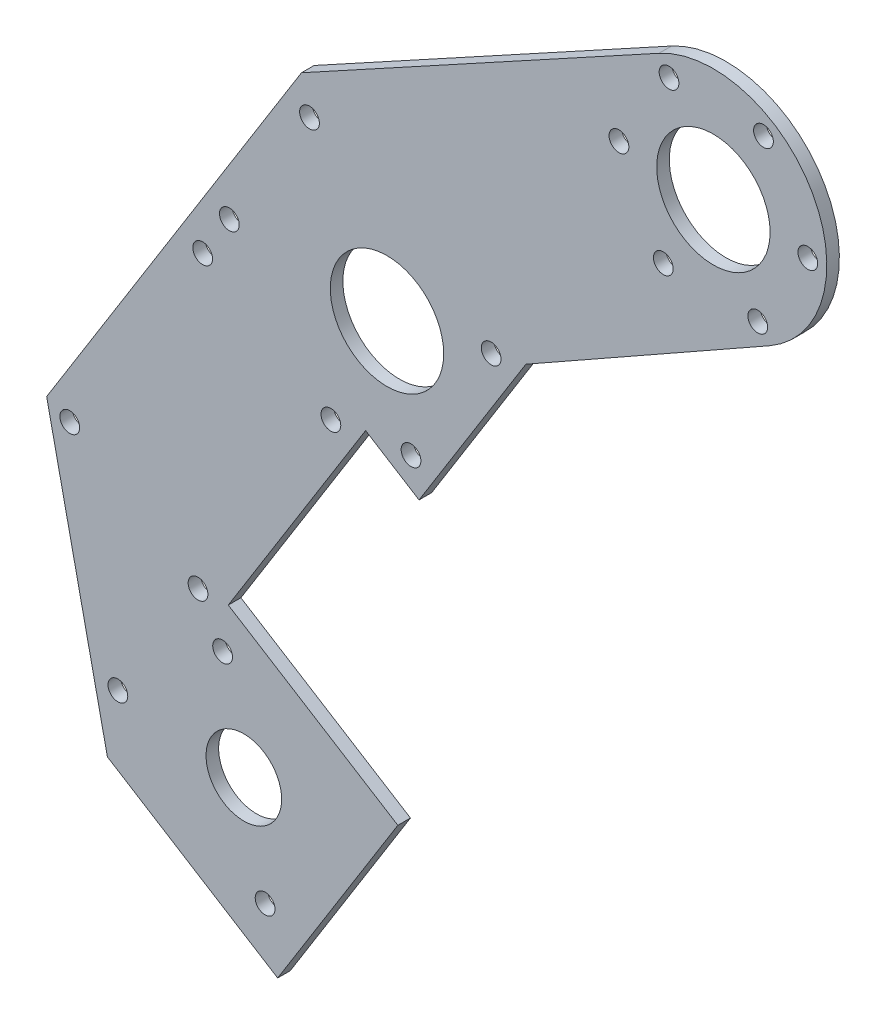
ISO-10303-21;
HEADER;
FILE_DESCRIPTION(('STEP AP214'),'2;1');
FILE_NAME('part.step','',(''),(''),'','','');
FILE_SCHEMA(('AUTOMOTIVE_DESIGN { 1 0 10303 214 1 1 1 1 }'));
ENDSEC;
DATA;
#1=APPLICATION_CONTEXT('core data for automotive mechanical design processes');
#2=APPLICATION_PROTOCOL_DEFINITION('international standard','automotive_design',2000,#1);
#3=PRODUCT_CONTEXT('',#1,'mechanical');
#4=PRODUCT('Part','Part','',(#3));
#5=PRODUCT_RELATED_PRODUCT_CATEGORY('part','',(#4));
#6=PRODUCT_DEFINITION_FORMATION('','',#4);
#7=PRODUCT_DEFINITION_CONTEXT('part definition',#1,'design');
#8=PRODUCT_DEFINITION('design','',#6,#7);
#9=PRODUCT_DEFINITION_SHAPE('','',#8);
#10=(LENGTH_UNIT() NAMED_UNIT(*) SI_UNIT(.MILLI.,.METRE.));
#11=(NAMED_UNIT(*) PLANE_ANGLE_UNIT() SI_UNIT($,.RADIAN.));
#12=(NAMED_UNIT(*) SI_UNIT($,.STERADIAN.) SOLID_ANGLE_UNIT());
#13=UNCERTAINTY_MEASURE_WITH_UNIT(LENGTH_MEASURE(1.E-05),#10,'distance_accuracy_value','');
#14=(GEOMETRIC_REPRESENTATION_CONTEXT(3) GLOBAL_UNCERTAINTY_ASSIGNED_CONTEXT((#13)) GLOBAL_UNIT_ASSIGNED_CONTEXT((#10,
#11,#12)) REPRESENTATION_CONTEXT('',''));
#15=CARTESIAN_POINT('',(0.,0.,0.));
#16=DIRECTION('',(0.,0.,1.));
#17=DIRECTION('',(1.,0.,0.));
#18=AXIS2_PLACEMENT_3D('',#15,#16,#17);
#19=CARTESIAN_POINT('',(98.394472265717,685.809641801936,-11.0195994744183));
#20=DIRECTION('',(0.,0.,1.));
#21=DIRECTION('',(1.,0.,0.));
#22=AXIS2_PLACEMENT_3D('',#19,#20,#21);
#23=PLANE('',#22);
#24=CARTESIAN_POINT('',(111.01317474527,706.00378709166,-11.0195994744183));
#25=DIRECTION('',(0.,0.,1.));
#26=DIRECTION('',(1.,0.,0.));
#27=AXIS2_PLACEMENT_3D('',#24,#25,#26);
#28=CIRCLE('',#27,2.48919999999998);
#29=CARTESIAN_POINT('',(113.50237474527,706.00378709166,-11.0195994744183));
#30=VERTEX_POINT('',#29);
#31=EDGE_CURVE('E375',#30,#30,#28,.T.);
#32=ORIENTED_EDGE('',*,*,#31,.F.);
#33=EDGE_LOOP('',(#32));
#34=FACE_BOUND('',#33,.T.);
#35=CARTESIAN_POINT('',(122.192466334109,684.978597536707,-11.0195994744183));
#36=DIRECTION('',(0.,0.,1.));
#37=DIRECTION('',(1.,0.,0.));
#38=AXIS2_PLACEMENT_3D('',#35,#36,#37);
#39=CIRCLE('',#38,2.48919999999998);
#40=CARTESIAN_POINT('',(124.681666334109,684.978597536707,-11.0195994744183));
#41=VERTEX_POINT('',#40);
#42=EDGE_CURVE('E379',#41,#41,#39,.T.);
#43=ORIENTED_EDGE('',*,*,#42,.F.);
#44=EDGE_LOOP('',(#43));
#45=FACE_BOUND('',#44,.T.);
#46=CARTESIAN_POINT('',(109.573763854556,664.784452246982,-11.0195994744183));
#47=DIRECTION('',(0.,0.,1.));
#48=DIRECTION('',(1.,0.,0.));
#49=AXIS2_PLACEMENT_3D('',#46,#47,#48);
#50=CIRCLE('',#49,2.48919999999998);
#51=CARTESIAN_POINT('',(112.062963854556,664.784452246982,-11.0195994744183));
#52=VERTEX_POINT('',#51);
#53=EDGE_CURVE('E389',#52,#52,#50,.T.);
#54=ORIENTED_EDGE('',*,*,#53,.F.);
#55=EDGE_LOOP('',(#54));
#56=FACE_BOUND('',#55,.T.);
#57=CARTESIAN_POINT('',(85.7757697861638,665.61549651221,-11.0195994744183));
#58=DIRECTION('',(0.,0.,1.));
#59=DIRECTION('',(1.,0.,0.));
#60=AXIS2_PLACEMENT_3D('',#57,#58,#59);
#61=CIRCLE('',#60,2.48919999999998);
#62=CARTESIAN_POINT('',(88.2649697861638,665.61549651221,-11.0195994744183));
#63=VERTEX_POINT('',#62);
#64=EDGE_CURVE('E397',#63,#63,#61,.T.);
#65=ORIENTED_EDGE('',*,*,#64,.F.);
#66=EDGE_LOOP('',(#65));
#67=FACE_BOUND('',#66,.T.);
#68=CARTESIAN_POINT('',(74.5964781973248,686.640686067164,-11.0195994744183));
#69=DIRECTION('',(0.,0.,1.));
#70=DIRECTION('',(1.,0.,0.));
#71=AXIS2_PLACEMENT_3D('',#68,#69,#70);
#72=CIRCLE('',#71,2.48919999999998);
#73=CARTESIAN_POINT('',(77.0856781973248,686.640686067164,-11.0195994744183));
#74=VERTEX_POINT('',#73);
#75=EDGE_CURVE('E405',#74,#74,#72,.T.);
#76=ORIENTED_EDGE('',*,*,#75,.F.);
#77=EDGE_LOOP('',(#76));
#78=FACE_BOUND('',#77,.T.);
#79=CARTESIAN_POINT('',(87.2151806768779,706.834831356889,-11.0195994744183));
#80=DIRECTION('',(0.,0.,1.));
#81=DIRECTION('',(1.,0.,0.));
#82=AXIS2_PLACEMENT_3D('',#79,#80,#81);
#83=CIRCLE('',#82,2.48919999999998);
#84=CARTESIAN_POINT('',(89.7043806768779,706.834831356889,-11.0195994744183));
#85=VERTEX_POINT('',#84);
#86=EDGE_CURVE('E413',#85,#85,#83,.T.);
#87=ORIENTED_EDGE('',*,*,#86,.F.);
#88=EDGE_LOOP('',(#87));
#89=FACE_BOUND('',#88,.T.);
#90=CARTESIAN_POINT('',(-25.2787103792217,525.372785730047,-11.0195994744183));
#91=DIRECTION('',(0.,0.,1.));
#92=DIRECTION('',(1.,0.,0.));
#93=AXIS2_PLACEMENT_3D('',#90,#91,#92);
#94=CIRCLE('',#93,2.48919999999999);
#95=CARTESIAN_POINT('',(-22.7895103792217,525.372785730047,-11.0195994744183));
#96=VERTEX_POINT('',#95);
#97=EDGE_CURVE('E421',#96,#96,#94,.T.);
#98=ORIENTED_EDGE('',*,*,#97,.F.);
#99=EDGE_LOOP('',(#98));
#100=FACE_BOUND('',#99,.T.);
#101=CARTESIAN_POINT('',(-14.5684366072069,475.714654112672,-11.0195994744183));
#102=DIRECTION('',(0.,0.,1.));
#103=DIRECTION('',(1.,0.,0.));
#104=AXIS2_PLACEMENT_3D('',#101,#102,#103);
#105=CIRCLE('',#104,2.48919999999999);
#106=CARTESIAN_POINT('',(-12.0792366072069,475.714654112672,-11.0195994744183));
#107=VERTEX_POINT('',#106);
#108=EDGE_CURVE('E429',#107,#107,#105,.T.);
#109=ORIENTED_EDGE('',*,*,#108,.F.);
#110=EDGE_LOOP('',(#109));
#111=FACE_BOUND('',#110,.T.);
#112=CARTESIAN_POINT('',(-3.3816119758126,652.837445435395,-11.0195994744183));
#113=DIRECTION('',(0.,0.,1.));
#114=DIRECTION('',(1.,0.,0.));
#115=AXIS2_PLACEMENT_3D('',#112,#113,#114);
#116=CIRCLE('',#115,2.48919999999999);
#117=CARTESIAN_POINT('',(-0.892411975812611,652.837445435395,-11.0195994744183));
#118=VERTEX_POINT('',#117);
#119=EDGE_CURVE('E437',#118,#118,#116,.T.);
#120=ORIENTED_EDGE('',*,*,#119,.F.);
#121=EDGE_LOOP('',(#120));
#122=FACE_BOUND('',#121,.T.);
#123=CARTESIAN_POINT('',(42.3917840142308,624.235053148408,-11.0195994744183));
#124=DIRECTION('',(0.,0.,1.));
#125=DIRECTION('',(1.,0.,0.));
#126=AXIS2_PLACEMENT_3D('',#123,#124,#125);
#127=CIRCLE('',#126,2.48919999999999);
#128=CARTESIAN_POINT('',(44.8809840142308,624.235053148408,-11.0195994744183));
#129=VERTEX_POINT('',#128);
#130=EDGE_CURVE('E445',#129,#129,#127,.T.);
#131=ORIENTED_EDGE('',*,*,#130,.F.);
#132=EDGE_LOOP('',(#131));
#133=FACE_BOUND('',#132,.T.);
#134=CARTESIAN_POINT('',(22.2018600469461,591.924420684848,-11.0195994744183));
#135=DIRECTION('',(0.,0.,1.));
#136=DIRECTION('',(1.,0.,0.));
#137=AXIS2_PLACEMENT_3D('',#134,#135,#136);
#138=CIRCLE('',#137,2.48919999999999);
#139=CARTESIAN_POINT('',(24.6910600469461,591.924420684848,-11.0195994744183));
#140=VERTEX_POINT('',#139);
#141=EDGE_CURVE('E453',#140,#140,#138,.T.);
#142=ORIENTED_EDGE('',*,*,#141,.F.);
#143=EDGE_LOOP('',(#142));
#144=FACE_BOUND('',#143,.T.);
#145=CARTESIAN_POINT('',(-23.5715359430975,620.526812971834,-11.0195994744183));
#146=DIRECTION('',(0.,0.,1.));
#147=DIRECTION('',(1.,0.,0.));
#148=AXIS2_PLACEMENT_3D('',#145,#146,#147);
#149=CIRCLE('',#148,2.48919999999999);
#150=CARTESIAN_POINT('',(-21.0823359430975,620.526812971834,-11.0195994744183));
#151=VERTEX_POINT('',#150);
#152=EDGE_CURVE('E461',#151,#151,#149,.T.);
#153=ORIENTED_EDGE('',*,*,#152,.F.);
#154=EDGE_LOOP('',(#153));
#155=FACE_BOUND('',#154,.T.);
#156=CARTESIAN_POINT('',(-31.4748442986401,535.981130962536,-11.0195994744183));
#157=DIRECTION('',(0.,0.,1.));
#158=DIRECTION('',(1.,0.,0.));
#159=AXIS2_PLACEMENT_3D('',#156,#157,#158);
#160=CIRCLE('',#159,2.48919999999999);
#161=CARTESIAN_POINT('',(-28.9856442986401,535.981130962536,-11.0195994744183));
#162=VERTEX_POINT('',#161);
#163=EDGE_CURVE('E469',#162,#162,#160,.T.);
#164=ORIENTED_EDGE('',*,*,#163,.F.);
#165=EDGE_LOOP('',(#164));
#166=FACE_BOUND('',#165,.T.);
#167=CARTESIAN_POINT('',(-63.7854767622009,556.17105492982,-11.0195994744183));
#168=DIRECTION('',(0.,0.,1.));
#169=DIRECTION('',(1.,0.,0.));
#170=AXIS2_PLACEMENT_3D('',#167,#168,#169);
#171=CIRCLE('',#170,2.48919999999999);
#172=CARTESIAN_POINT('',(-61.2962767622009,556.17105492982,-11.0195994744183));
#173=VERTEX_POINT('',#172);
#174=EDGE_CURVE('E477',#173,#173,#171,.T.);
#175=ORIENTED_EDGE('',*,*,#174,.F.);
#176=EDGE_LOOP('',(#175));
#177=FACE_BOUND('',#176,.T.);
#178=CARTESIAN_POINT('',(-51.6647682659239,503.670498498975,-11.0195994744183));
#179=DIRECTION('',(0.,0.,1.));
#180=DIRECTION('',(1.,0.,0.));
#181=AXIS2_PLACEMENT_3D('',#178,#179,#180);
#182=CIRCLE('',#181,2.48919999999999);
#183=CARTESIAN_POINT('',(-49.1755682659239,503.670498498975,-11.0195994744183));
#184=VERTEX_POINT('',#183);
#185=EDGE_CURVE('E485',#184,#184,#182,.T.);
#186=ORIENTED_EDGE('',*,*,#185,.F.);
#187=EDGE_LOOP('',(#186));
#188=FACE_BOUND('',#187,.T.);
#189=CARTESIAN_POINT('',(2.0091218648738,589.566678183255,-11.0195994744183));
#190=DIRECTION('',(0.,0.,1.));
#191=DIRECTION('',(1.,0.,0.));
#192=AXIS2_PLACEMENT_3D('',#189,#190,#191);
#193=CIRCLE('',#192,2.48919999999999);
#194=CARTESIAN_POINT('',(4.49832186487379,589.566678183255,-11.0195994744183));
#195=VERTEX_POINT('',#194);
#196=EDGE_CURVE('E493',#195,#195,#193,.T.);
#197=ORIENTED_EDGE('',*,*,#196,.F.);
#198=EDGE_LOOP('',(#197));
#199=FACE_BOUND('',#198,.T.);
#200=CARTESIAN_POINT('',(-30.3015105986869,609.756602150538,-11.0195994744183));
#201=DIRECTION('',(0.,0.,1.));
#202=DIRECTION('',(1.,0.,0.));
#203=AXIS2_PLACEMENT_3D('',#200,#201,#202);
#204=CIRCLE('',#203,2.48919999999999);
#205=CARTESIAN_POINT('',(-27.8123105986869,609.756602150538,-11.0195994744183));
#206=VERTEX_POINT('',#205);
#207=EDGE_CURVE('E501',#206,#206,#204,.T.);
#208=ORIENTED_EDGE('',*,*,#207,.F.);
#209=EDGE_LOOP('',(#208));
#210=FACE_BOUND('',#209,.T.);
#211=CARTESIAN_POINT('',(16.1415062297891,618.174698630963,-11.0195994744183));
#212=DIRECTION('',(0.,0.,1.));
#213=DIRECTION('',(1.,0.,0.));
#214=AXIS2_PLACEMENT_3D('',#211,#212,#213);
#215=CIRCLE('',#214,14.2875);
#216=CARTESIAN_POINT('',(30.4290062297891,618.174698630963,-11.0195994744183));
#217=VERTEX_POINT('',#216);
#218=EDGE_CURVE('E518',#217,#217,#215,.T.);
#219=ORIENTED_EDGE('',*,*,#218,.F.);
#220=EDGE_LOOP('',(#219));
#221=FACE_BOUND('',#220,.T.);
#222=DIRECTION('',(0.848048096156436,-0.529919264233189,0.));
#223=VECTOR('',#222,1.);
#224=CARTESIAN_POINT('',(-11.4036028792613,461.040918112805,-11.0195994744183));
#225=LINE('',#224,#223);
#226=CARTESIAN_POINT('',(-54.3078997353251,487.850498283378,-11.0195994744183));
#227=VERTEX_POINT('',#226);
#228=CARTESIAN_POINT('',(-11.4036028792613,461.040918112805,-11.0195994744183));
#229=VERTEX_POINT('',#228);
#230=EDGE_CURVE('E195',#227,#229,#225,.T.);
#231=ORIENTED_EDGE('',*,*,#230,.T.);
#232=DIRECTION('',(0.529919264233189,0.848048096156436,0.));
#233=VECTOR('',#232,1.);
#234=CARTESIAN_POINT('',(-11.4036028792613,461.040918112805,-11.0195994744183));
#235=LINE('',#234,#233);
#236=CARTESIAN_POINT('',(18.8812830716653,509.506866808146,-11.0195994744183));
#237=VERTEX_POINT('',#236);
#238=EDGE_CURVE('E113',#229,#237,#235,.T.);
#239=ORIENTED_EDGE('',*,*,#238,.T.);
#240=DIRECTION('',(-0.848048096156436,0.529919264233189,0.));
#241=VECTOR('',#240,1.);
#242=CARTESIAN_POINT('',(18.8812830716653,509.506866808146,-11.0195994744183));
#243=LINE('',#242,#241);
#244=CARTESIAN_POINT('',(-23.8464673555439,536.206128526138,-11.0195994744183));
#245=VERTEX_POINT('',#244);
#246=EDGE_CURVE('E228',#237,#245,#243,.T.);
#247=ORIENTED_EDGE('',*,*,#246,.T.);
#248=DIRECTION('',(0.529919264233191,0.848048096156435,0.));
#249=VECTOR('',#248,1.);
#250=CARTESIAN_POINT('',(-23.8464673555439,536.206128526138,-11.0195994744183));
#251=LINE('',#250,#249);
#252=CARTESIAN_POINT('',(10.7592146033479,591.586796265968,-11.0195994744183));
#253=VERTEX_POINT('',#252);
#254=EDGE_CURVE('E248',#245,#253,#251,.T.);
#255=ORIENTED_EDGE('',*,*,#254,.T.);
#256=DIRECTION('',(0.848048096156436,-0.529919264233189,0.));
#257=VECTOR('',#256,1.);
#258=CARTESIAN_POINT('',(10.7592146033479,591.586796265968,-11.0195994744183));
#259=LINE('',#258,#257);
#260=CARTESIAN_POINT('',(24.2219781298311,583.174327946266,-11.0195994744183));
#261=VERTEX_POINT('',#260);
#262=EDGE_CURVE('E244',#253,#261,#259,.T.);
#263=ORIENTED_EDGE('',*,*,#262,.T.);
#264=DIRECTION('',(0.529919264233189,0.848048096156436,0.));
#265=VECTOR('',#264,1.);
#266=CARTESIAN_POINT('',(24.2219781298311,583.174327946266,-11.0195994744183));
#267=LINE('',#266,#265);
#268=CARTESIAN_POINT('',(51.1418767528772,626.255171231013,-11.0195994744183));
#269=VERTEX_POINT('',#268);
#270=EDGE_CURVE('E247',#261,#269,#267,.T.);
#271=ORIENTED_EDGE('',*,*,#270,.T.);
#272=DIRECTION('',(0.87042361723326,0.49230349030102,0.));
#273=VECTOR('',#272,1.);
#274=CARTESIAN_POINT('',(51.1418767528772,626.255171231013,-11.0195994744183));
#275=LINE('',#274,#273);
#276=CARTESIAN_POINT('',(112.462044501226,660.937286939583,-11.0195994744183));
#277=VERTEX_POINT('',#276);
#278=EDGE_CURVE('E252',#269,#277,#275,.T.);
#279=ORIENTED_EDGE('',*,*,#278,.T.);
#280=CARTESIAN_POINT('',(98.394472265717,685.809641801936,-11.0195994744183));
#281=DIRECTION('',(0.,0.,1.));
#282=DIRECTION('',(1.,0.,0.));
#283=AXIS2_PLACEMENT_3D('',#280,#281,#282);
#284=CIRCLE('',#283,28.5750000000007);
#285=CARTESIAN_POINT('',(84.6779568869163,710.877306848029,-11.0195994744183));
#286=VERTEX_POINT('',#285);
#287=EDGE_CURVE('E141',#277,#286,#284,.T.);
#288=ORIENTED_EDGE('',*,*,#287,.T.);
#289=DIRECTION('',(-0.877258619282813,-0.480018036009078,0.));
#290=VECTOR('',#289,1.);
#291=CARTESIAN_POINT('',(-5.40173005852552,661.587538173868,-11.0195994744183));
#292=LINE('',#291,#290);
#293=CARTESIAN_POINT('',(-5.40173005852552,661.587538173868,-11.0195994744183));
#294=VERTEX_POINT('',#293);
#295=EDGE_CURVE('E135',#286,#294,#292,.T.);
#296=ORIENTED_EDGE('',*,*,#295,.T.);
#297=DIRECTION('',(-0.529919264233189,-0.848048096156436,0.));
#298=VECTOR('',#297,1.);
#299=CARTESIAN_POINT('',(-69.6154861059628,558.824047131732,-11.0195994744183));
#300=LINE('',#299,#298);
#301=CARTESIAN_POINT('',(-69.6154861059628,558.824047131732,-11.0195994744183));
#302=VERTEX_POINT('',#301);
#303=EDGE_CURVE('E139',#294,#302,#300,.T.);
#304=ORIENTED_EDGE('',*,*,#303,.T.);
#305=DIRECTION('',(0.210832160866466,-0.977522275932562,0.));
#306=VECTOR('',#305,1.);
#307=CARTESIAN_POINT('',(-54.3078997353251,487.850498283378,-11.0195994744183));
#308=LINE('',#307,#306);
#309=EDGE_CURVE('E61',#302,#227,#308,.T.);
#310=ORIENTED_EDGE('',*,*,#309,.T.);
#311=EDGE_LOOP('',(#231,#239,#247,#255,#263,#271,#279,#288,#296,#304,#310));
#312=FACE_BOUND('',#311,.T.);
#313=CARTESIAN_POINT('',(98.394472265717,685.809641801936,-11.0195994744183));
#314=DIRECTION('',(0.,0.,1.));
#315=DIRECTION('',(1.,0.,0.));
#316=AXIS2_PLACEMENT_3D('',#313,#314,#315);
#317=CIRCLE('',#316,14.2875000001997);
#318=CARTESIAN_POINT('',(112.681972265917,685.809641801936,-11.0195994744183));
#319=VERTEX_POINT('',#318);
#320=EDGE_CURVE('E168',#319,#319,#317,.T.);
#321=ORIENTED_EDGE('',*,*,#320,.F.);
#322=EDGE_LOOP('',(#321));
#323=FACE_BOUND('',#322,.T.);
#324=CARTESIAN_POINT('',(-19.9235734932144,500.543719921359,-11.0195994744183));
#325=DIRECTION('',(0.,0.,1.));
#326=DIRECTION('',(1.,0.,0.));
#327=AXIS2_PLACEMENT_3D('',#324,#325,#326);
#328=CIRCLE('',#327,9.525);
#329=CARTESIAN_POINT('',(-10.3985734932144,500.543719921359,-11.0195994744183));
#330=VERTEX_POINT('',#329);
#331=EDGE_CURVE('E510',#330,#330,#328,.T.);
#332=ORIENTED_EDGE('',*,*,#331,.F.);
#333=EDGE_LOOP('',(#332));
#334=FACE_BOUND('',#333,.T.);
#335=ADVANCED_FACE('F43',(#34,#45,#56,#67,#78,#89,#100,#111,#122,#133,#144,#155,#166,#177,#188,
#199,#210,#221,#312,#323,#334),#23,.T.);
#336=CARTESIAN_POINT('',(98.394472265717,685.809641801936,-14.1945994744183));
#337=DIRECTION('',(0.,0.,1.));
#338=DIRECTION('',(1.,0.,0.));
#339=AXIS2_PLACEMENT_3D('',#336,#337,#338);
#340=PLANE('',#339);
#341=CARTESIAN_POINT('',(111.01317474527,706.00378709166,-14.1945994744183));
#342=DIRECTION('',(0.,0.,1.));
#343=DIRECTION('',(1.,0.,0.));
#344=AXIS2_PLACEMENT_3D('',#341,#342,#343);
#345=CIRCLE('',#344,2.4892);
#346=CARTESIAN_POINT('',(113.50237474527,706.00378709166,-14.1945994744183));
#347=VERTEX_POINT('',#346);
#348=EDGE_CURVE('E373',#347,#347,#345,.T.);
#349=ORIENTED_EDGE('',*,*,#348,.T.);
#350=EDGE_LOOP('',(#349));
#351=FACE_BOUND('',#350,.T.);
#352=CARTESIAN_POINT('',(122.192466334109,684.978597536707,-14.1945994744183));
#353=DIRECTION('',(0.,0.,1.));
#354=DIRECTION('',(1.,0.,0.));
#355=AXIS2_PLACEMENT_3D('',#352,#353,#354);
#356=CIRCLE('',#355,2.4892);
#357=CARTESIAN_POINT('',(124.681666334109,684.978597536707,-14.1945994744183));
#358=VERTEX_POINT('',#357);
#359=EDGE_CURVE('E385',#358,#358,#356,.T.);
#360=ORIENTED_EDGE('',*,*,#359,.T.);
#361=EDGE_LOOP('',(#360));
#362=FACE_BOUND('',#361,.T.);
#363=CARTESIAN_POINT('',(109.573763854556,664.784452246982,-14.1945994744183));
#364=DIRECTION('',(0.,0.,1.));
#365=DIRECTION('',(1.,0.,0.));
#366=AXIS2_PLACEMENT_3D('',#363,#364,#365);
#367=CIRCLE('',#366,2.4892);
#368=CARTESIAN_POINT('',(112.062963854556,664.784452246982,-14.1945994744183));
#369=VERTEX_POINT('',#368);
#370=EDGE_CURVE('E393',#369,#369,#367,.T.);
#371=ORIENTED_EDGE('',*,*,#370,.T.);
#372=EDGE_LOOP('',(#371));
#373=FACE_BOUND('',#372,.T.);
#374=CARTESIAN_POINT('',(85.7757697861638,665.61549651221,-14.1945994744183));
#375=DIRECTION('',(0.,0.,1.));
#376=DIRECTION('',(1.,0.,0.));
#377=AXIS2_PLACEMENT_3D('',#374,#375,#376);
#378=CIRCLE('',#377,2.4892);
#379=CARTESIAN_POINT('',(88.2649697861638,665.61549651221,-14.1945994744183));
#380=VERTEX_POINT('',#379);
#381=EDGE_CURVE('E401',#380,#380,#378,.T.);
#382=ORIENTED_EDGE('',*,*,#381,.T.);
#383=EDGE_LOOP('',(#382));
#384=FACE_BOUND('',#383,.T.);
#385=CARTESIAN_POINT('',(74.5964781973248,686.640686067164,-14.1945994744183));
#386=DIRECTION('',(0.,0.,1.));
#387=DIRECTION('',(1.,0.,0.));
#388=AXIS2_PLACEMENT_3D('',#385,#386,#387);
#389=CIRCLE('',#388,2.4892);
#390=CARTESIAN_POINT('',(77.0856781973248,686.640686067164,-14.1945994744183));
#391=VERTEX_POINT('',#390);
#392=EDGE_CURVE('E409',#391,#391,#389,.T.);
#393=ORIENTED_EDGE('',*,*,#392,.T.);
#394=EDGE_LOOP('',(#393));
#395=FACE_BOUND('',#394,.T.);
#396=CARTESIAN_POINT('',(87.2151806768779,706.834831356889,-14.1945994744183));
#397=DIRECTION('',(0.,0.,1.));
#398=DIRECTION('',(1.,0.,0.));
#399=AXIS2_PLACEMENT_3D('',#396,#397,#398);
#400=CIRCLE('',#399,2.4892);
#401=CARTESIAN_POINT('',(89.7043806768779,706.834831356889,-14.1945994744183));
#402=VERTEX_POINT('',#401);
#403=EDGE_CURVE('E417',#402,#402,#400,.T.);
#404=ORIENTED_EDGE('',*,*,#403,.T.);
#405=EDGE_LOOP('',(#404));
#406=FACE_BOUND('',#405,.T.);
#407=CARTESIAN_POINT('',(-25.2787103792217,525.372785730047,-14.1945994744183));
#408=DIRECTION('',(0.,0.,1.));
#409=DIRECTION('',(1.,0.,0.));
#410=AXIS2_PLACEMENT_3D('',#407,#408,#409);
#411=CIRCLE('',#410,2.4892);
#412=CARTESIAN_POINT('',(-22.7895103792217,525.372785730047,-14.1945994744183));
#413=VERTEX_POINT('',#412);
#414=EDGE_CURVE('E425',#413,#413,#411,.T.);
#415=ORIENTED_EDGE('',*,*,#414,.T.);
#416=EDGE_LOOP('',(#415));
#417=FACE_BOUND('',#416,.T.);
#418=CARTESIAN_POINT('',(-14.5684366072069,475.714654112672,-14.1945994744183));
#419=DIRECTION('',(0.,0.,1.));
#420=DIRECTION('',(1.,0.,0.));
#421=AXIS2_PLACEMENT_3D('',#418,#419,#420);
#422=CIRCLE('',#421,2.4892);
#423=CARTESIAN_POINT('',(-12.0792366072069,475.714654112672,-14.1945994744183));
#424=VERTEX_POINT('',#423);
#425=EDGE_CURVE('E433',#424,#424,#422,.T.);
#426=ORIENTED_EDGE('',*,*,#425,.T.);
#427=EDGE_LOOP('',(#426));
#428=FACE_BOUND('',#427,.T.);
#429=CARTESIAN_POINT('',(-3.3816119758126,652.837445435395,-14.1945994744183));
#430=DIRECTION('',(0.,0.,1.));
#431=DIRECTION('',(1.,0.,0.));
#432=AXIS2_PLACEMENT_3D('',#429,#430,#431);
#433=CIRCLE('',#432,2.4892);
#434=CARTESIAN_POINT('',(-0.892411975812604,652.837445435395,-14.1945994744183));
#435=VERTEX_POINT('',#434);
#436=EDGE_CURVE('E441',#435,#435,#433,.T.);
#437=ORIENTED_EDGE('',*,*,#436,.T.);
#438=EDGE_LOOP('',(#437));
#439=FACE_BOUND('',#438,.T.);
#440=CARTESIAN_POINT('',(42.3917840142308,624.235053148408,-14.1945994744183));
#441=DIRECTION('',(0.,0.,1.));
#442=DIRECTION('',(1.,0.,0.));
#443=AXIS2_PLACEMENT_3D('',#440,#441,#442);
#444=CIRCLE('',#443,2.4892);
#445=CARTESIAN_POINT('',(44.8809840142308,624.235053148408,-14.1945994744183));
#446=VERTEX_POINT('',#445);
#447=EDGE_CURVE('E449',#446,#446,#444,.T.);
#448=ORIENTED_EDGE('',*,*,#447,.T.);
#449=EDGE_LOOP('',(#448));
#450=FACE_BOUND('',#449,.T.);
#451=CARTESIAN_POINT('',(22.2018600469461,591.924420684848,-14.1945994744183));
#452=DIRECTION('',(0.,0.,1.));
#453=DIRECTION('',(1.,0.,0.));
#454=AXIS2_PLACEMENT_3D('',#451,#452,#453);
#455=CIRCLE('',#454,2.4892);
#456=CARTESIAN_POINT('',(24.6910600469461,591.924420684848,-14.1945994744183));
#457=VERTEX_POINT('',#456);
#458=EDGE_CURVE('E457',#457,#457,#455,.T.);
#459=ORIENTED_EDGE('',*,*,#458,.T.);
#460=EDGE_LOOP('',(#459));
#461=FACE_BOUND('',#460,.T.);
#462=CARTESIAN_POINT('',(-23.5715359430975,620.526812971834,-14.1945994744183));
#463=DIRECTION('',(0.,0.,1.));
#464=DIRECTION('',(1.,0.,0.));
#465=AXIS2_PLACEMENT_3D('',#462,#463,#464);
#466=CIRCLE('',#465,2.4892);
#467=CARTESIAN_POINT('',(-21.0823359430975,620.526812971834,-14.1945994744183));
#468=VERTEX_POINT('',#467);
#469=EDGE_CURVE('E465',#468,#468,#466,.T.);
#470=ORIENTED_EDGE('',*,*,#469,.T.);
#471=EDGE_LOOP('',(#470));
#472=FACE_BOUND('',#471,.T.);
#473=CARTESIAN_POINT('',(-31.4748442986401,535.981130962536,-14.1945994744183));
#474=DIRECTION('',(0.,0.,1.));
#475=DIRECTION('',(1.,0.,0.));
#476=AXIS2_PLACEMENT_3D('',#473,#474,#475);
#477=CIRCLE('',#476,2.4892);
#478=CARTESIAN_POINT('',(-28.9856442986401,535.981130962536,-14.1945994744183));
#479=VERTEX_POINT('',#478);
#480=EDGE_CURVE('E473',#479,#479,#477,.T.);
#481=ORIENTED_EDGE('',*,*,#480,.T.);
#482=EDGE_LOOP('',(#481));
#483=FACE_BOUND('',#482,.T.);
#484=CARTESIAN_POINT('',(-63.7854767622009,556.17105492982,-14.1945994744183));
#485=DIRECTION('',(0.,0.,1.));
#486=DIRECTION('',(1.,0.,0.));
#487=AXIS2_PLACEMENT_3D('',#484,#485,#486);
#488=CIRCLE('',#487,2.4892);
#489=CARTESIAN_POINT('',(-61.2962767622009,556.17105492982,-14.1945994744183));
#490=VERTEX_POINT('',#489);
#491=EDGE_CURVE('E481',#490,#490,#488,.T.);
#492=ORIENTED_EDGE('',*,*,#491,.T.);
#493=EDGE_LOOP('',(#492));
#494=FACE_BOUND('',#493,.T.);
#495=CARTESIAN_POINT('',(-51.6647682659239,503.670498498975,-14.1945994744183));
#496=DIRECTION('',(0.,0.,1.));
#497=DIRECTION('',(1.,0.,0.));
#498=AXIS2_PLACEMENT_3D('',#495,#496,#497);
#499=CIRCLE('',#498,2.4892);
#500=CARTESIAN_POINT('',(-49.1755682659239,503.670498498975,-14.1945994744183));
#501=VERTEX_POINT('',#500);
#502=EDGE_CURVE('E489',#501,#501,#499,.T.);
#503=ORIENTED_EDGE('',*,*,#502,.T.);
#504=EDGE_LOOP('',(#503));
#505=FACE_BOUND('',#504,.T.);
#506=CARTESIAN_POINT('',(2.0091218648738,589.566678183255,-14.1945994744183));
#507=DIRECTION('',(0.,0.,1.));
#508=DIRECTION('',(1.,0.,0.));
#509=AXIS2_PLACEMENT_3D('',#506,#507,#508);
#510=CIRCLE('',#509,2.4892);
#511=CARTESIAN_POINT('',(4.4983218648738,589.566678183255,-14.1945994744183));
#512=VERTEX_POINT('',#511);
#513=EDGE_CURVE('E497',#512,#512,#510,.T.);
#514=ORIENTED_EDGE('',*,*,#513,.T.);
#515=EDGE_LOOP('',(#514));
#516=FACE_BOUND('',#515,.T.);
#517=CARTESIAN_POINT('',(-30.3015105986869,609.756602150538,-14.1945994744183));
#518=DIRECTION('',(0.,0.,1.));
#519=DIRECTION('',(1.,0.,0.));
#520=AXIS2_PLACEMENT_3D('',#517,#518,#519);
#521=CIRCLE('',#520,2.4892);
#522=CARTESIAN_POINT('',(-27.8123105986869,609.756602150538,-14.1945994744183));
#523=VERTEX_POINT('',#522);
#524=EDGE_CURVE('E505',#523,#523,#521,.T.);
#525=ORIENTED_EDGE('',*,*,#524,.T.);
#526=EDGE_LOOP('',(#525));
#527=FACE_BOUND('',#526,.T.);
#528=DIRECTION('',(0.848048096156436,-0.529919264233189,0.));
#529=VECTOR('',#528,1.);
#530=CARTESIAN_POINT('',(-11.4036028792613,461.040918112805,-14.1945994744183));
#531=LINE('',#530,#529);
#532=CARTESIAN_POINT('',(-54.3078997353251,487.850498283378,-14.1945994744183));
#533=VERTEX_POINT('',#532);
#534=CARTESIAN_POINT('',(-11.4036028792613,461.040918112805,-14.1945994744183));
#535=VERTEX_POINT('',#534);
#536=EDGE_CURVE('E163',#533,#535,#531,.T.);
#537=ORIENTED_EDGE('',*,*,#536,.F.);
#538=DIRECTION('',(0.210832160866466,-0.977522275932562,0.));
#539=VECTOR('',#538,1.);
#540=CARTESIAN_POINT('',(-54.3078997353251,487.850498283378,-14.1945994744183));
#541=LINE('',#540,#539);
#542=CARTESIAN_POINT('',(-69.6154861059628,558.824047131732,-14.1945994744183));
#543=VERTEX_POINT('',#542);
#544=EDGE_CURVE('E105',#543,#533,#541,.T.);
#545=ORIENTED_EDGE('',*,*,#544,.F.);
#546=DIRECTION('',(-0.529919264233189,-0.848048096156436,0.));
#547=VECTOR('',#546,1.);
#548=CARTESIAN_POINT('',(-69.6154861059628,558.824047131732,-14.1945994744183));
#549=LINE('',#548,#547);
#550=CARTESIAN_POINT('',(-5.40173005852552,661.587538173868,-14.1945994744183));
#551=VERTEX_POINT('',#550);
#552=EDGE_CURVE('E99',#551,#543,#549,.T.);
#553=ORIENTED_EDGE('',*,*,#552,.F.);
#554=DIRECTION('',(-0.877258619282813,-0.480018036009078,0.));
#555=VECTOR('',#554,1.);
#556=CARTESIAN_POINT('',(-5.40173005852552,661.587538173868,-14.1945994744183));
#557=LINE('',#556,#555);
#558=CARTESIAN_POINT('',(84.6779568869163,710.877306848029,-14.1945994744183));
#559=VERTEX_POINT('',#558);
#560=EDGE_CURVE('E150',#559,#551,#557,.T.);
#561=ORIENTED_EDGE('',*,*,#560,.F.);
#562=CARTESIAN_POINT('',(98.394472265717,685.809641801936,-14.1945994744183));
#563=DIRECTION('',(0.,0.,1.));
#564=DIRECTION('',(1.,0.,0.));
#565=AXIS2_PLACEMENT_3D('',#562,#563,#564);
#566=CIRCLE('',#565,28.5750000000007);
#567=CARTESIAN_POINT('',(112.462044501226,660.937286939583,-14.1945994744183));
#568=VERTEX_POINT('',#567);
#569=EDGE_CURVE('E186',#568,#559,#566,.T.);
#570=ORIENTED_EDGE('',*,*,#569,.F.);
#571=DIRECTION('',(0.87042361723326,0.49230349030102,0.));
#572=VECTOR('',#571,1.);
#573=CARTESIAN_POINT('',(51.1418767528772,626.255171231013,-14.1945994744183));
#574=LINE('',#573,#572);
#575=CARTESIAN_POINT('',(51.1418767528772,626.255171231013,-14.1945994744183));
#576=VERTEX_POINT('',#575);
#577=EDGE_CURVE('E183',#576,#568,#574,.T.);
#578=ORIENTED_EDGE('',*,*,#577,.F.);
#579=DIRECTION('',(0.529919264233189,0.848048096156436,0.));
#580=VECTOR('',#579,1.);
#581=CARTESIAN_POINT('',(24.2219781298311,583.174327946266,-14.1945994744183));
#582=LINE('',#581,#580);
#583=CARTESIAN_POINT('',(24.2219781298311,583.174327946266,-14.1945994744183));
#584=VERTEX_POINT('',#583);
#585=EDGE_CURVE('E180',#584,#576,#582,.T.);
#586=ORIENTED_EDGE('',*,*,#585,.F.);
#587=DIRECTION('',(0.848048096156436,-0.529919264233189,0.));
#588=VECTOR('',#587,1.);
#589=CARTESIAN_POINT('',(10.7592146033479,591.586796265968,-14.1945994744183));
#590=LINE('',#589,#588);
#591=CARTESIAN_POINT('',(10.7592146033479,591.586796265968,-14.1945994744183));
#592=VERTEX_POINT('',#591);
#593=EDGE_CURVE('E177',#592,#584,#590,.T.);
#594=ORIENTED_EDGE('',*,*,#593,.F.);
#595=DIRECTION('',(0.529919264233191,0.848048096156435,0.));
#596=VECTOR('',#595,1.);
#597=CARTESIAN_POINT('',(-23.8464673555439,536.206128526138,-14.1945994744183));
#598=LINE('',#597,#596);
#599=CARTESIAN_POINT('',(-23.8464673555439,536.206128526138,-14.1945994744183));
#600=VERTEX_POINT('',#599);
#601=EDGE_CURVE('E174',#600,#592,#598,.T.);
#602=ORIENTED_EDGE('',*,*,#601,.F.);
#603=DIRECTION('',(-0.848048096156436,0.529919264233189,0.));
#604=VECTOR('',#603,1.);
#605=CARTESIAN_POINT('',(18.8812830716653,509.506866808146,-14.1945994744183));
#606=LINE('',#605,#604);
#607=CARTESIAN_POINT('',(18.8812830716653,509.506866808146,-14.1945994744183));
#608=VERTEX_POINT('',#607);
#609=EDGE_CURVE('E171',#608,#600,#606,.T.);
#610=ORIENTED_EDGE('',*,*,#609,.F.);
#611=DIRECTION('',(0.529919264233189,0.848048096156436,0.));
#612=VECTOR('',#611,1.);
#613=CARTESIAN_POINT('',(-11.4036028792613,461.040918112805,-14.1945994744183));
#614=LINE('',#613,#612);
#615=EDGE_CURVE('E167',#535,#608,#614,.T.);
#616=ORIENTED_EDGE('',*,*,#615,.F.);
#617=EDGE_LOOP('',(#537,#545,#553,#561,#570,#578,#586,#594,#602,#610,#616));
#618=FACE_BOUND('',#617,.T.);
#619=CARTESIAN_POINT('',(98.394472265717,685.809641801936,-14.1945994744183));
#620=DIRECTION('',(0.,0.,1.));
#621=DIRECTION('',(1.,0.,0.));
#622=AXIS2_PLACEMENT_3D('',#619,#620,#621);
#623=CIRCLE('',#622,14.2875000001997);
#624=CARTESIAN_POINT('',(112.681972265917,685.809641801936,-14.1945994744183));
#625=VERTEX_POINT('',#624);
#626=EDGE_CURVE('E522',#625,#625,#623,.T.);
#627=ORIENTED_EDGE('',*,*,#626,.T.);
#628=EDGE_LOOP('',(#627));
#629=FACE_BOUND('',#628,.T.);
#630=CARTESIAN_POINT('',(16.1415062297891,618.174698630963,-14.1945994744183));
#631=DIRECTION('',(0.,0.,1.));
#632=DIRECTION('',(1.,0.,0.));
#633=AXIS2_PLACEMENT_3D('',#630,#631,#632);
#634=CIRCLE('',#633,14.2875);
#635=CARTESIAN_POINT('',(30.4290062297891,618.174698630963,-14.1945994744183));
#636=VERTEX_POINT('',#635);
#637=EDGE_CURVE('E514',#636,#636,#634,.T.);
#638=ORIENTED_EDGE('',*,*,#637,.T.);
#639=EDGE_LOOP('',(#638));
#640=FACE_BOUND('',#639,.T.);
#641=CARTESIAN_POINT('',(-19.9235734932144,500.543719921359,-14.1945994744183));
#642=DIRECTION('',(0.,0.,1.));
#643=DIRECTION('',(1.,0.,0.));
#644=AXIS2_PLACEMENT_3D('',#641,#642,#643);
#645=CIRCLE('',#644,9.525);
#646=CARTESIAN_POINT('',(-10.3985734932144,500.543719921359,-14.1945994744183));
#647=VERTEX_POINT('',#646);
#648=EDGE_CURVE('E509',#647,#647,#645,.T.);
#649=ORIENTED_EDGE('',*,*,#648,.T.);
#650=EDGE_LOOP('',(#649));
#651=FACE_BOUND('',#650,.T.);
#652=ADVANCED_FACE('F232',(#351,#362,#373,#384,#395,#406,#417,#428,#439,#450,#461,#472,#483,
#494,#505,#516,#527,#618,#629,#640,#651),#340,.F.);
#653=CARTESIAN_POINT('',(-11.4036028792613,461.040918112805,-11.0195994744183));
#654=DIRECTION('',(0.529919264233189,0.848048096156436,0.));
#655=DIRECTION('',(-0.848048096156436,0.529919264233189,0.));
#656=AXIS2_PLACEMENT_3D('',#653,#654,#655);
#657=PLANE('',#656);
#658=ORIENTED_EDGE('',*,*,#536,.T.);
#659=DIRECTION('',(0.,0.,-1.));
#660=VECTOR('',#659,1.);
#661=CARTESIAN_POINT('',(-11.4036028792613,461.040918112805,-11.0195994744183));
#662=LINE('',#661,#660);
#663=EDGE_CURVE('E11',#229,#535,#662,.T.);
#664=ORIENTED_EDGE('',*,*,#663,.F.);
#665=ORIENTED_EDGE('',*,*,#230,.F.);
#666=DIRECTION('',(0.,0.,-1.));
#667=VECTOR('',#666,1.);
#668=CARTESIAN_POINT('',(-54.3078997353251,487.850498283378,-11.0195994744183));
#669=LINE('',#668,#667);
#670=EDGE_CURVE('E159',#227,#533,#669,.T.);
#671=ORIENTED_EDGE('',*,*,#670,.T.);
#672=EDGE_LOOP('',(#658,#664,#665,#671));
#673=FACE_BOUND('',#672,.T.);
#674=ADVANCED_FACE('F45',(#673),#657,.F.);
#675=CARTESIAN_POINT('',(-11.4036028792613,461.040918112805,-11.0195994744183));
#676=DIRECTION('',(-0.848048096156436,0.529919264233189,0.));
#677=DIRECTION('',(-0.529919264233189,-0.848048096156436,0.));
#678=AXIS2_PLACEMENT_3D('',#675,#676,#677);
#679=PLANE('',#678);
#680=ORIENTED_EDGE('',*,*,#615,.T.);
#681=DIRECTION('',(0.,0.,-1.));
#682=VECTOR('',#681,1.);
#683=CARTESIAN_POINT('',(18.8812830716653,509.506866808146,-11.0195994744183));
#684=LINE('',#683,#682);
#685=EDGE_CURVE('E53',#237,#608,#684,.T.);
#686=ORIENTED_EDGE('',*,*,#685,.F.);
#687=ORIENTED_EDGE('',*,*,#238,.F.);
#688=ORIENTED_EDGE('',*,*,#663,.T.);
#689=EDGE_LOOP('',(#680,#686,#687,#688));
#690=FACE_BOUND('',#689,.T.);
#691=ADVANCED_FACE('F783',(#690),#679,.F.);
#692=CARTESIAN_POINT('',(18.8812830716653,509.506866808146,-11.0195994744183));
#693=DIRECTION('',(-0.529919264233189,-0.848048096156436,0.));
#694=DIRECTION('',(0.848048096156436,-0.529919264233189,0.));
#695=AXIS2_PLACEMENT_3D('',#692,#693,#694);
#696=PLANE('',#695);
#697=ORIENTED_EDGE('',*,*,#609,.T.);
#698=DIRECTION('',(0.,0.,-1.));
#699=VECTOR('',#698,1.);
#700=CARTESIAN_POINT('',(-23.8464673555439,536.206128526138,-11.0195994744183));
#701=LINE('',#700,#699);
#702=EDGE_CURVE('E218',#245,#600,#701,.T.);
#703=ORIENTED_EDGE('',*,*,#702,.F.);
#704=ORIENTED_EDGE('',*,*,#246,.F.);
#705=ORIENTED_EDGE('',*,*,#685,.T.);
#706=EDGE_LOOP('',(#697,#703,#704,#705));
#707=FACE_BOUND('',#706,.T.);
#708=ADVANCED_FACE('F226',(#707),#696,.F.);
#709=CARTESIAN_POINT('',(-23.8464673555439,536.206128526138,-11.0195994744183));
#710=DIRECTION('',(-0.848048096156435,0.529919264233191,0.));
#711=DIRECTION('',(-0.529919264233191,-0.848048096156435,0.));
#712=AXIS2_PLACEMENT_3D('',#709,#710,#711);
#713=PLANE('',#712);
#714=ORIENTED_EDGE('',*,*,#601,.T.);
#715=DIRECTION('',(0.,0.,-1.));
#716=VECTOR('',#715,1.);
#717=CARTESIAN_POINT('',(10.7592146033479,591.586796265968,-11.0195994744183));
#718=LINE('',#717,#716);
#719=EDGE_CURVE('E214',#253,#592,#718,.T.);
#720=ORIENTED_EDGE('',*,*,#719,.F.);
#721=ORIENTED_EDGE('',*,*,#254,.F.);
#722=ORIENTED_EDGE('',*,*,#702,.T.);
#723=EDGE_LOOP('',(#714,#720,#721,#722));
#724=FACE_BOUND('',#723,.T.);
#725=ADVANCED_FACE('F238',(#724),#713,.F.);
#726=CARTESIAN_POINT('',(10.7592146033479,591.586796265968,-11.0195994744183));
#727=DIRECTION('',(0.529919264233189,0.848048096156436,0.));
#728=DIRECTION('',(-0.848048096156436,0.529919264233189,0.));
#729=AXIS2_PLACEMENT_3D('',#726,#727,#728);
#730=PLANE('',#729);
#731=ORIENTED_EDGE('',*,*,#593,.T.);
#732=DIRECTION('',(0.,0.,-1.));
#733=VECTOR('',#732,1.);
#734=CARTESIAN_POINT('',(24.2219781298311,583.174327946266,-11.0195994744183));
#735=LINE('',#734,#733);
#736=EDGE_CURVE('E210',#261,#584,#735,.T.);
#737=ORIENTED_EDGE('',*,*,#736,.F.);
#738=ORIENTED_EDGE('',*,*,#262,.F.);
#739=ORIENTED_EDGE('',*,*,#719,.T.);
#740=EDGE_LOOP('',(#731,#737,#738,#739));
#741=FACE_BOUND('',#740,.T.);
#742=ADVANCED_FACE('F242',(#741),#730,.F.);
#743=CARTESIAN_POINT('',(24.2219781298311,583.174327946266,-11.0195994744183));
#744=DIRECTION('',(-0.848048096156436,0.529919264233189,0.));
#745=DIRECTION('',(-0.52991926423319,-0.848048096156436,0.));
#746=AXIS2_PLACEMENT_3D('',#743,#744,#745);
#747=PLANE('',#746);
#748=ORIENTED_EDGE('',*,*,#585,.T.);
#749=DIRECTION('',(0.,0.,-1.));
#750=VECTOR('',#749,1.);
#751=CARTESIAN_POINT('',(51.1418767528772,626.255171231013,-11.0195994744183));
#752=LINE('',#751,#750);
#753=EDGE_CURVE('E206',#269,#576,#752,.T.);
#754=ORIENTED_EDGE('',*,*,#753,.F.);
#755=ORIENTED_EDGE('',*,*,#270,.F.);
#756=ORIENTED_EDGE('',*,*,#736,.T.);
#757=EDGE_LOOP('',(#748,#754,#755,#756));
#758=FACE_BOUND('',#757,.T.);
#759=ADVANCED_FACE('F745',(#758),#747,.F.);
#760=CARTESIAN_POINT('',(51.1418767528772,626.255171231013,-11.0195994744183));
#761=DIRECTION('',(-0.49230349030102,0.87042361723326,0.));
#762=DIRECTION('',(-0.870423617233261,-0.49230349030102,0.));
#763=AXIS2_PLACEMENT_3D('',#760,#761,#762);
#764=PLANE('',#763);
#765=ORIENTED_EDGE('',*,*,#577,.T.);
#766=DIRECTION('',(0.,0.,-1.));
#767=VECTOR('',#766,1.);
#768=CARTESIAN_POINT('',(112.462044501226,660.937286939583,-11.0195994744183));
#769=LINE('',#768,#767);
#770=EDGE_CURVE('E202',#277,#568,#769,.T.);
#771=ORIENTED_EDGE('',*,*,#770,.F.);
#772=ORIENTED_EDGE('',*,*,#278,.F.);
#773=ORIENTED_EDGE('',*,*,#753,.T.);
#774=EDGE_LOOP('',(#765,#771,#772,#773));
#775=FACE_BOUND('',#774,.T.);
#776=ADVANCED_FACE('F263',(#775),#764,.F.);
#777=CARTESIAN_POINT('',(98.394472265717,685.809641801936,-11.0195994744183));
#778=DIRECTION('',(0.,0.,-1.));
#779=DIRECTION('',(-1.,0.,0.));
#780=AXIS2_PLACEMENT_3D('',#777,#778,#779);
#781=CYLINDRICAL_SURFACE('',#780,28.5750000000007);
#782=ORIENTED_EDGE('',*,*,#569,.T.);
#783=DIRECTION('',(0.,0.,-1.));
#784=VECTOR('',#783,1.);
#785=CARTESIAN_POINT('',(84.6779568869163,710.877306848029,-11.0195994744183));
#786=LINE('',#785,#784);
#787=EDGE_CURVE('E152',#286,#559,#786,.T.);
#788=ORIENTED_EDGE('',*,*,#787,.F.);
#789=ORIENTED_EDGE('',*,*,#287,.F.);
#790=ORIENTED_EDGE('',*,*,#770,.T.);
#791=EDGE_LOOP('',(#782,#788,#789,#790));
#792=FACE_BOUND('',#791,.T.);
#793=ADVANCED_FACE('F267',(#792),#781,.T.);
#794=CARTESIAN_POINT('',(-5.40173005852552,661.587538173868,-11.0195994744183));
#795=DIRECTION('',(0.480018036009078,-0.877258619282813,0.));
#796=DIRECTION('',(0.877258619282813,0.480018036009078,0.));
#797=AXIS2_PLACEMENT_3D('',#794,#795,#796);
#798=PLANE('',#797);
#799=ORIENTED_EDGE('',*,*,#560,.T.);
#800=DIRECTION('',(0.,0.,-1.));
#801=VECTOR('',#800,1.);
#802=CARTESIAN_POINT('',(-5.40173005852552,661.587538173868,-11.0195994744183));
#803=LINE('',#802,#801);
#804=EDGE_CURVE('E147',#294,#551,#803,.T.);
#805=ORIENTED_EDGE('',*,*,#804,.F.);
#806=ORIENTED_EDGE('',*,*,#295,.F.);
#807=ORIENTED_EDGE('',*,*,#787,.T.);
#808=EDGE_LOOP('',(#799,#805,#806,#807));
#809=FACE_BOUND('',#808,.T.);
#810=ADVANCED_FACE('F148',(#809),#798,.F.);
#811=CARTESIAN_POINT('',(-69.6154861059628,558.824047131732,-11.0195994744183));
#812=DIRECTION('',(0.848048096156436,-0.529919264233189,0.));
#813=DIRECTION('',(0.529919264233189,0.848048096156436,0.));
#814=AXIS2_PLACEMENT_3D('',#811,#812,#813);
#815=PLANE('',#814);
#816=ORIENTED_EDGE('',*,*,#552,.T.);
#817=DIRECTION('',(0.,0.,-1.));
#818=VECTOR('',#817,1.);
#819=CARTESIAN_POINT('',(-69.6154861059628,558.824047131732,-11.0195994744183));
#820=LINE('',#819,#818);
#821=EDGE_CURVE('E153',#302,#543,#820,.T.);
#822=ORIENTED_EDGE('',*,*,#821,.F.);
#823=ORIENTED_EDGE('',*,*,#303,.F.);
#824=ORIENTED_EDGE('',*,*,#804,.T.);
#825=EDGE_LOOP('',(#816,#822,#823,#824));
#826=FACE_BOUND('',#825,.T.);
#827=ADVANCED_FACE('F155',(#826),#815,.F.);
#828=CARTESIAN_POINT('',(-54.3078997353251,487.850498283378,-11.0195994744183));
#829=DIRECTION('',(0.977522275932562,0.210832160866467,0.));
#830=DIRECTION('',(-0.210832160866466,0.977522275932562,0.));
#831=AXIS2_PLACEMENT_3D('',#828,#829,#830);
#832=PLANE('',#831);
#833=ORIENTED_EDGE('',*,*,#544,.T.);
#834=ORIENTED_EDGE('',*,*,#670,.F.);
#835=ORIENTED_EDGE('',*,*,#309,.F.);
#836=ORIENTED_EDGE('',*,*,#821,.T.);
#837=EDGE_LOOP('',(#833,#834,#835,#836));
#838=FACE_BOUND('',#837,.T.);
#839=ADVANCED_FACE('F271',(#838),#832,.F.);
#840=CARTESIAN_POINT('',(98.394472265717,685.809641801936,-11.0195994744183));
#841=DIRECTION('',(0.,0.,-1.));
#842=DIRECTION('',(-1.,0.,0.));
#843=AXIS2_PLACEMENT_3D('',#840,#841,#842);
#844=CYLINDRICAL_SURFACE('',#843,14.2875000001997);
#845=ORIENTED_EDGE('',*,*,#320,.T.);
#846=EDGE_LOOP('',(#845));
#847=FACE_BOUND('',#846,.T.);
#848=ORIENTED_EDGE('',*,*,#626,.F.);
#849=EDGE_LOOP('',(#848));
#850=FACE_BOUND('',#849,.T.);
#851=ADVANCED_FACE('F273',(#847,#850),#844,.F.);
#852=CARTESIAN_POINT('',(16.1415062297891,618.174698630963,-11.0195994744183));
#853=DIRECTION('',(0.,0.,-1.));
#854=DIRECTION('',(-1.,0.,0.));
#855=AXIS2_PLACEMENT_3D('',#852,#853,#854);
#856=CYLINDRICAL_SURFACE('',#855,14.2875);
#857=ORIENTED_EDGE('',*,*,#218,.T.);
#858=EDGE_LOOP('',(#857));
#859=FACE_BOUND('',#858,.T.);
#860=ORIENTED_EDGE('',*,*,#637,.F.);
#861=EDGE_LOOP('',(#860));
#862=FACE_BOUND('',#861,.T.);
#863=ADVANCED_FACE('F279',(#859,#862),#856,.F.);
#864=CARTESIAN_POINT('',(-19.9235734932144,500.543719921359,-11.0195994744183));
#865=DIRECTION('',(0.,0.,-1.));
#866=DIRECTION('',(-1.,0.,0.));
#867=AXIS2_PLACEMENT_3D('',#864,#865,#866);
#868=CYLINDRICAL_SURFACE('',#867,9.525);
#869=ORIENTED_EDGE('',*,*,#331,.T.);
#870=EDGE_LOOP('',(#869));
#871=FACE_BOUND('',#870,.T.);
#872=ORIENTED_EDGE('',*,*,#648,.F.);
#873=EDGE_LOOP('',(#872));
#874=FACE_BOUND('',#873,.T.);
#875=ADVANCED_FACE('F296',(#871,#874),#868,.F.);
#876=CARTESIAN_POINT('',(-30.3015105986869,609.756602150538,-11.0195994744183));
#877=DIRECTION('',(0.,0.,1.));
#878=DIRECTION('',(1.,0.,0.));
#879=AXIS2_PLACEMENT_3D('',#876,#877,#878);
#880=CYLINDRICAL_SURFACE('',#879,2.48919999999999);
#881=ORIENTED_EDGE('',*,*,#524,.F.);
#882=EDGE_LOOP('',(#881));
#883=FACE_BOUND('',#882,.T.);
#884=ORIENTED_EDGE('',*,*,#207,.T.);
#885=EDGE_LOOP('',(#884));
#886=FACE_BOUND('',#885,.T.);
#887=ADVANCED_FACE('F300',(#883,#886),#880,.F.);
#888=CARTESIAN_POINT('',(2.0091218648738,589.566678183255,-11.0195994744183));
#889=DIRECTION('',(0.,0.,1.));
#890=DIRECTION('',(1.,0.,0.));
#891=AXIS2_PLACEMENT_3D('',#888,#889,#890);
#892=CYLINDRICAL_SURFACE('',#891,2.48919999999999);
#893=ORIENTED_EDGE('',*,*,#513,.F.);
#894=EDGE_LOOP('',(#893));
#895=FACE_BOUND('',#894,.T.);
#896=ORIENTED_EDGE('',*,*,#196,.T.);
#897=EDGE_LOOP('',(#896));
#898=FACE_BOUND('',#897,.T.);
#899=ADVANCED_FACE('F304',(#895,#898),#892,.F.);
#900=CARTESIAN_POINT('',(-51.6647682659239,503.670498498975,-11.0195994744183));
#901=DIRECTION('',(0.,0.,1.));
#902=DIRECTION('',(1.,0.,0.));
#903=AXIS2_PLACEMENT_3D('',#900,#901,#902);
#904=CYLINDRICAL_SURFACE('',#903,2.48919999999999);
#905=ORIENTED_EDGE('',*,*,#502,.F.);
#906=EDGE_LOOP('',(#905));
#907=FACE_BOUND('',#906,.T.);
#908=ORIENTED_EDGE('',*,*,#185,.T.);
#909=EDGE_LOOP('',(#908));
#910=FACE_BOUND('',#909,.T.);
#911=ADVANCED_FACE('F308',(#907,#910),#904,.F.);
#912=CARTESIAN_POINT('',(-63.7854767622009,556.17105492982,-11.0195994744183));
#913=DIRECTION('',(0.,0.,1.));
#914=DIRECTION('',(1.,0.,0.));
#915=AXIS2_PLACEMENT_3D('',#912,#913,#914);
#916=CYLINDRICAL_SURFACE('',#915,2.48919999999999);
#917=ORIENTED_EDGE('',*,*,#491,.F.);
#918=EDGE_LOOP('',(#917));
#919=FACE_BOUND('',#918,.T.);
#920=ORIENTED_EDGE('',*,*,#174,.T.);
#921=EDGE_LOOP('',(#920));
#922=FACE_BOUND('',#921,.T.);
#923=ADVANCED_FACE('F312',(#919,#922),#916,.F.);
#924=CARTESIAN_POINT('',(-31.4748442986401,535.981130962536,-11.0195994744183));
#925=DIRECTION('',(0.,0.,1.));
#926=DIRECTION('',(1.,0.,0.));
#927=AXIS2_PLACEMENT_3D('',#924,#925,#926);
#928=CYLINDRICAL_SURFACE('',#927,2.48919999999999);
#929=ORIENTED_EDGE('',*,*,#480,.F.);
#930=EDGE_LOOP('',(#929));
#931=FACE_BOUND('',#930,.T.);
#932=ORIENTED_EDGE('',*,*,#163,.T.);
#933=EDGE_LOOP('',(#932));
#934=FACE_BOUND('',#933,.T.);
#935=ADVANCED_FACE('F316',(#931,#934),#928,.F.);
#936=CARTESIAN_POINT('',(-23.5715359430975,620.526812971834,-11.0195994744183));
#937=DIRECTION('',(0.,0.,1.));
#938=DIRECTION('',(1.,0.,0.));
#939=AXIS2_PLACEMENT_3D('',#936,#937,#938);
#940=CYLINDRICAL_SURFACE('',#939,2.48919999999999);
#941=ORIENTED_EDGE('',*,*,#469,.F.);
#942=EDGE_LOOP('',(#941));
#943=FACE_BOUND('',#942,.T.);
#944=ORIENTED_EDGE('',*,*,#152,.T.);
#945=EDGE_LOOP('',(#944));
#946=FACE_BOUND('',#945,.T.);
#947=ADVANCED_FACE('F320',(#943,#946),#940,.F.);
#948=CARTESIAN_POINT('',(22.2018600469461,591.924420684848,-11.0195994744183));
#949=DIRECTION('',(0.,0.,1.));
#950=DIRECTION('',(1.,0.,0.));
#951=AXIS2_PLACEMENT_3D('',#948,#949,#950);
#952=CYLINDRICAL_SURFACE('',#951,2.48919999999999);
#953=ORIENTED_EDGE('',*,*,#458,.F.);
#954=EDGE_LOOP('',(#953));
#955=FACE_BOUND('',#954,.T.);
#956=ORIENTED_EDGE('',*,*,#141,.T.);
#957=EDGE_LOOP('',(#956));
#958=FACE_BOUND('',#957,.T.);
#959=ADVANCED_FACE('F324',(#955,#958),#952,.F.);
#960=CARTESIAN_POINT('',(42.3917840142308,624.235053148408,-11.0195994744183));
#961=DIRECTION('',(0.,0.,1.));
#962=DIRECTION('',(1.,0.,0.));
#963=AXIS2_PLACEMENT_3D('',#960,#961,#962);
#964=CYLINDRICAL_SURFACE('',#963,2.48919999999999);
#965=ORIENTED_EDGE('',*,*,#447,.F.);
#966=EDGE_LOOP('',(#965));
#967=FACE_BOUND('',#966,.T.);
#968=ORIENTED_EDGE('',*,*,#130,.T.);
#969=EDGE_LOOP('',(#968));
#970=FACE_BOUND('',#969,.T.);
#971=ADVANCED_FACE('F328',(#967,#970),#964,.F.);
#972=CARTESIAN_POINT('',(-3.3816119758126,652.837445435395,-11.0195994744183));
#973=DIRECTION('',(0.,0.,1.));
#974=DIRECTION('',(1.,0.,0.));
#975=AXIS2_PLACEMENT_3D('',#972,#973,#974);
#976=CYLINDRICAL_SURFACE('',#975,2.48919999999999);
#977=ORIENTED_EDGE('',*,*,#436,.F.);
#978=EDGE_LOOP('',(#977));
#979=FACE_BOUND('',#978,.T.);
#980=ORIENTED_EDGE('',*,*,#119,.T.);
#981=EDGE_LOOP('',(#980));
#982=FACE_BOUND('',#981,.T.);
#983=ADVANCED_FACE('F332',(#979,#982),#976,.F.);
#984=CARTESIAN_POINT('',(-14.5684366072069,475.714654112672,-11.0195994744183));
#985=DIRECTION('',(0.,0.,1.));
#986=DIRECTION('',(1.,0.,0.));
#987=AXIS2_PLACEMENT_3D('',#984,#985,#986);
#988=CYLINDRICAL_SURFACE('',#987,2.48919999999999);
#989=ORIENTED_EDGE('',*,*,#425,.F.);
#990=EDGE_LOOP('',(#989));
#991=FACE_BOUND('',#990,.T.);
#992=ORIENTED_EDGE('',*,*,#108,.T.);
#993=EDGE_LOOP('',(#992));
#994=FACE_BOUND('',#993,.T.);
#995=ADVANCED_FACE('F336',(#991,#994),#988,.F.);
#996=CARTESIAN_POINT('',(-25.2787103792217,525.372785730047,-11.0195994744183));
#997=DIRECTION('',(0.,0.,1.));
#998=DIRECTION('',(1.,0.,0.));
#999=AXIS2_PLACEMENT_3D('',#996,#997,#998);
#1000=CYLINDRICAL_SURFACE('',#999,2.48919999999999);
#1001=ORIENTED_EDGE('',*,*,#414,.F.);
#1002=EDGE_LOOP('',(#1001));
#1003=FACE_BOUND('',#1002,.T.);
#1004=ORIENTED_EDGE('',*,*,#97,.T.);
#1005=EDGE_LOOP('',(#1004));
#1006=FACE_BOUND('',#1005,.T.);
#1007=ADVANCED_FACE('F340',(#1003,#1006),#1000,.F.);
#1008=CARTESIAN_POINT('',(87.2151806768779,706.834831356889,-11.0195994744183));
#1009=DIRECTION('',(0.,0.,1.));
#1010=DIRECTION('',(1.,0.,0.));
#1011=AXIS2_PLACEMENT_3D('',#1008,#1009,#1010);
#1012=CYLINDRICAL_SURFACE('',#1011,2.48919999999999);
#1013=ORIENTED_EDGE('',*,*,#403,.F.);
#1014=EDGE_LOOP('',(#1013));
#1015=FACE_BOUND('',#1014,.T.);
#1016=ORIENTED_EDGE('',*,*,#86,.T.);
#1017=EDGE_LOOP('',(#1016));
#1018=FACE_BOUND('',#1017,.T.);
#1019=ADVANCED_FACE('F344',(#1015,#1018),#1012,.F.);
#1020=CARTESIAN_POINT('',(74.5964781973248,686.640686067164,-11.0195994744183));
#1021=DIRECTION('',(0.,0.,1.));
#1022=DIRECTION('',(1.,0.,0.));
#1023=AXIS2_PLACEMENT_3D('',#1020,#1021,#1022);
#1024=CYLINDRICAL_SURFACE('',#1023,2.48919999999999);
#1025=ORIENTED_EDGE('',*,*,#392,.F.);
#1026=EDGE_LOOP('',(#1025));
#1027=FACE_BOUND('',#1026,.T.);
#1028=ORIENTED_EDGE('',*,*,#75,.T.);
#1029=EDGE_LOOP('',(#1028));
#1030=FACE_BOUND('',#1029,.T.);
#1031=ADVANCED_FACE('F348',(#1027,#1030),#1024,.F.);
#1032=CARTESIAN_POINT('',(85.7757697861638,665.61549651221,-11.0195994744183));
#1033=DIRECTION('',(0.,0.,1.));
#1034=DIRECTION('',(1.,0.,0.));
#1035=AXIS2_PLACEMENT_3D('',#1032,#1033,#1034);
#1036=CYLINDRICAL_SURFACE('',#1035,2.48919999999999);
#1037=ORIENTED_EDGE('',*,*,#381,.F.);
#1038=EDGE_LOOP('',(#1037));
#1039=FACE_BOUND('',#1038,.T.);
#1040=ORIENTED_EDGE('',*,*,#64,.T.);
#1041=EDGE_LOOP('',(#1040));
#1042=FACE_BOUND('',#1041,.T.);
#1043=ADVANCED_FACE('F352',(#1039,#1042),#1036,.F.);
#1044=CARTESIAN_POINT('',(109.573763854556,664.784452246982,-11.0195994744183));
#1045=DIRECTION('',(0.,0.,1.));
#1046=DIRECTION('',(1.,0.,0.));
#1047=AXIS2_PLACEMENT_3D('',#1044,#1045,#1046);
#1048=CYLINDRICAL_SURFACE('',#1047,2.48919999999999);
#1049=ORIENTED_EDGE('',*,*,#370,.F.);
#1050=EDGE_LOOP('',(#1049));
#1051=FACE_BOUND('',#1050,.T.);
#1052=ORIENTED_EDGE('',*,*,#53,.T.);
#1053=EDGE_LOOP('',(#1052));
#1054=FACE_BOUND('',#1053,.T.);
#1055=ADVANCED_FACE('F356',(#1051,#1054),#1048,.F.);
#1056=CARTESIAN_POINT('',(122.192466334109,684.978597536707,-11.0195994744183));
#1057=DIRECTION('',(0.,0.,1.));
#1058=DIRECTION('',(1.,0.,0.));
#1059=AXIS2_PLACEMENT_3D('',#1056,#1057,#1058);
#1060=CYLINDRICAL_SURFACE('',#1059,2.48919999999999);
#1061=ORIENTED_EDGE('',*,*,#359,.F.);
#1062=EDGE_LOOP('',(#1061));
#1063=FACE_BOUND('',#1062,.T.);
#1064=ORIENTED_EDGE('',*,*,#42,.T.);
#1065=EDGE_LOOP('',(#1064));
#1066=FACE_BOUND('',#1065,.T.);
#1067=ADVANCED_FACE('F360',(#1063,#1066),#1060,.F.);
#1068=CARTESIAN_POINT('',(111.01317474527,706.00378709166,-11.0195994744183));
#1069=DIRECTION('',(0.,0.,1.));
#1070=DIRECTION('',(1.,0.,0.));
#1071=AXIS2_PLACEMENT_3D('',#1068,#1069,#1070);
#1072=CYLINDRICAL_SURFACE('',#1071,2.48919999999999);
#1073=ORIENTED_EDGE('',*,*,#348,.F.);
#1074=EDGE_LOOP('',(#1073));
#1075=FACE_BOUND('',#1074,.T.);
#1076=ORIENTED_EDGE('',*,*,#31,.T.);
#1077=EDGE_LOOP('',(#1076));
#1078=FACE_BOUND('',#1077,.T.);
#1079=ADVANCED_FACE('F364',(#1075,#1078),#1072,.F.);
#1080=CLOSED_SHELL('',(#335,#652,#674,#691,#708,#725,#742,#759,#776,#793,#810,#827,#839,#851,
#863,#875,#887,#899,#911,#923,#935,#947,#959,#971,#983,#995,#1007,#1019,#1031,#1043,#1055,#1067,#1079));
#1081=MANIFOLD_SOLID_BREP('B2',#1080);
#1082=ADVANCED_BREP_SHAPE_REPRESENTATION('',(#18,#1081),#14);
#1083=SHAPE_DEFINITION_REPRESENTATION(#9,#1082);
ENDSEC;
END-ISO-10303-21;
